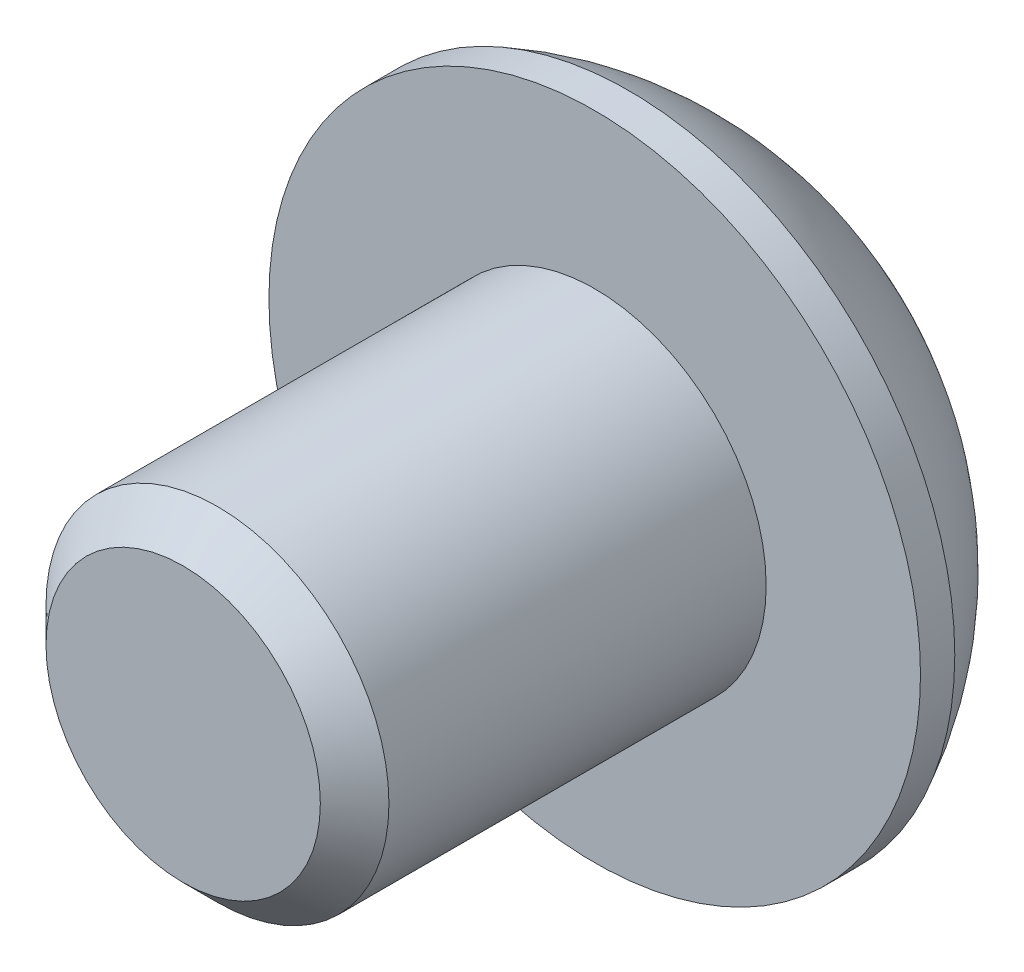
ISO-10303-21;
HEADER;
FILE_DESCRIPTION(('STEP AP214'),'2;1');
FILE_NAME('part.step','',(''),(''),'','','');
FILE_SCHEMA(('AUTOMOTIVE_DESIGN { 1 0 10303 214 1 1 1 1 }'));
ENDSEC;
DATA;
#1=APPLICATION_CONTEXT('core data for automotive mechanical design processes');
#2=APPLICATION_PROTOCOL_DEFINITION('international standard','automotive_design',2000,#1);
#3=PRODUCT_CONTEXT('',#1,'mechanical');
#4=PRODUCT('Part','Part','',(#3));
#5=PRODUCT_RELATED_PRODUCT_CATEGORY('part','',(#4));
#6=PRODUCT_DEFINITION_FORMATION('','',#4);
#7=PRODUCT_DEFINITION_CONTEXT('part definition',#1,'design');
#8=PRODUCT_DEFINITION('design','',#6,#7);
#9=PRODUCT_DEFINITION_SHAPE('','',#8);
#10=(LENGTH_UNIT() NAMED_UNIT(*) SI_UNIT(.MILLI.,.METRE.));
#11=(NAMED_UNIT(*) PLANE_ANGLE_UNIT() SI_UNIT($,.RADIAN.));
#12=(NAMED_UNIT(*) SI_UNIT($,.STERADIAN.) SOLID_ANGLE_UNIT());
#13=UNCERTAINTY_MEASURE_WITH_UNIT(LENGTH_MEASURE(1.E-05),#10,'distance_accuracy_value','');
#14=(GEOMETRIC_REPRESENTATION_CONTEXT(3) GLOBAL_UNCERTAINTY_ASSIGNED_CONTEXT((#13)) GLOBAL_UNIT_ASSIGNED_CONTEXT((#10,
#11,#12)) REPRESENTATION_CONTEXT('',''));
#15=CARTESIAN_POINT('',(0.,0.,0.));
#16=DIRECTION('',(0.,0.,1.));
#17=DIRECTION('',(1.,0.,0.));
#18=AXIS2_PLACEMENT_3D('',#15,#16,#17);
#19=CARTESIAN_POINT('',(0.,0.,-1.21));
#20=DIRECTION('',(0.,0.,1.));
#21=DIRECTION('',(1.,0.,0.));
#22=AXIS2_PLACEMENT_3D('',#19,#20,#21);
#23=PLANE('',#22);
#24=DIRECTION('',(0.,1.,0.));
#25=VECTOR('',#24,1.);
#26=CARTESIAN_POINT('',(-1.5,-0.866025403784438,-1.21));
#27=LINE('',#26,#25);
#28=CARTESIAN_POINT('',(-1.5,-0.866025403784439,-1.21));
#29=VERTEX_POINT('',#28);
#30=CARTESIAN_POINT('',(-1.5,0.866025403784439,-1.21));
#31=VERTEX_POINT('',#30);
#32=EDGE_CURVE('E127',#29,#31,#27,.T.);
#33=ORIENTED_EDGE('',*,*,#32,.T.);
#34=DIRECTION('',(-0.866025403784439,-0.5,0.));
#35=VECTOR('',#34,1.);
#36=CARTESIAN_POINT('',(-1.5,0.866025403784439,-1.21));
#37=LINE('',#36,#35);
#38=CARTESIAN_POINT('',(0.,1.73205080756888,-1.21));
#39=VERTEX_POINT('',#38);
#40=EDGE_CURVE('E132',#31,#39,#37,.F.);
#41=ORIENTED_EDGE('',*,*,#40,.T.);
#42=DIRECTION('',(-0.866025403784439,0.5,0.));
#43=VECTOR('',#42,1.);
#44=CARTESIAN_POINT('',(0.,1.73205080756888,-1.21));
#45=LINE('',#44,#43);
#46=CARTESIAN_POINT('',(1.5,0.866025403784439,-1.21));
#47=VERTEX_POINT('',#46);
#48=EDGE_CURVE('E86',#39,#47,#45,.F.);
#49=ORIENTED_EDGE('',*,*,#48,.T.);
#50=DIRECTION('',(0.,1.,0.));
#51=VECTOR('',#50,1.);
#52=CARTESIAN_POINT('',(1.5,0.866025403784438,-1.21));
#53=LINE('',#52,#51);
#54=CARTESIAN_POINT('',(1.5,-0.866025403784438,-1.21));
#55=VERTEX_POINT('',#54);
#56=EDGE_CURVE('E68',#47,#55,#53,.F.);
#57=ORIENTED_EDGE('',*,*,#56,.T.);
#58=DIRECTION('',(0.866025403784439,0.499999999999999,0.));
#59=VECTOR('',#58,1.);
#60=CARTESIAN_POINT('',(1.5,-0.866025403784438,-1.21));
#61=LINE('',#60,#59);
#62=CARTESIAN_POINT('',(0.,-1.73205080756888,-1.21));
#63=VERTEX_POINT('',#62);
#64=EDGE_CURVE('E74',#55,#63,#61,.F.);
#65=ORIENTED_EDGE('',*,*,#64,.T.);
#66=DIRECTION('',(0.866025403784438,-0.5,0.));
#67=VECTOR('',#66,1.);
#68=CARTESIAN_POINT('',(0.,-1.73205080756888,-1.21));
#69=LINE('',#68,#67);
#70=EDGE_CURVE('E121',#63,#29,#69,.F.);
#71=ORIENTED_EDGE('',*,*,#70,.T.);
#72=EDGE_LOOP('',(#33,#41,#49,#57,#65,#71));
#73=FACE_BOUND('',#72,.T.);
#74=ADVANCED_FACE('F17',(#73),#23,.F.);
#75=CARTESIAN_POINT('',(1.5,-0.866025403784438,-2.75));
#76=DIRECTION('',(0.499999999999999,-0.866025403784439,0.));
#77=DIRECTION('',(0.866025403784439,0.499999999999999,0.));
#78=AXIS2_PLACEMENT_3D('',#75,#76,#77);
#79=PLANE('',#78);
#80=ORIENTED_EDGE('',*,*,#64,.F.);
#81=DIRECTION('',(0.,0.,-1.));
#82=VECTOR('',#81,1.);
#83=CARTESIAN_POINT('',(1.5,-0.866025403784438,-2.75));
#84=LINE('',#83,#82);
#85=CARTESIAN_POINT('',(1.5,-0.866025403784438,-2.75));
#86=VERTEX_POINT('',#85);
#87=EDGE_CURVE('E77',#55,#86,#84,.T.);
#88=ORIENTED_EDGE('',*,*,#87,.T.);
#89=DIRECTION('',(0.866025403784438,0.500000000000001,0.));
#90=VECTOR('',#89,1.);
#91=CARTESIAN_POINT('',(0.,-1.73205080756888,-2.75));
#92=LINE('',#91,#90);
#93=CARTESIAN_POINT('',(0.,-1.73205080756888,-2.75));
#94=VERTEX_POINT('',#93);
#95=EDGE_CURVE('E117',#94,#86,#92,.T.);
#96=ORIENTED_EDGE('',*,*,#95,.F.);
#97=DIRECTION('',(0.,0.,1.));
#98=VECTOR('',#97,1.);
#99=CARTESIAN_POINT('',(0.,-1.73205080756888,-2.75));
#100=LINE('',#99,#98);
#101=EDGE_CURVE('E79',#94,#63,#100,.T.);
#102=ORIENTED_EDGE('',*,*,#101,.T.);
#103=EDGE_LOOP('',(#80,#88,#96,#102));
#104=FACE_BOUND('',#103,.T.);
#105=ADVANCED_FACE('F75',(#104),#79,.F.);
#106=CARTESIAN_POINT('',(1.5,0.866025403784438,-2.75));
#107=DIRECTION('',(1.,0.,0.));
#108=DIRECTION('',(0.,0.,-1.));
#109=AXIS2_PLACEMENT_3D('',#106,#107,#108);
#110=PLANE('',#109);
#111=ORIENTED_EDGE('',*,*,#56,.F.);
#112=DIRECTION('',(0.,0.,1.));
#113=VECTOR('',#112,1.);
#114=CARTESIAN_POINT('',(1.5,0.866025403784441,-2.75));
#115=LINE('',#114,#113);
#116=CARTESIAN_POINT('',(1.5,0.866025403784439,-2.75));
#117=VERTEX_POINT('',#116);
#118=EDGE_CURVE('E134',#47,#117,#115,.F.);
#119=ORIENTED_EDGE('',*,*,#118,.T.);
#120=DIRECTION('',(0.,1.,0.));
#121=VECTOR('',#120,1.);
#122=CARTESIAN_POINT('',(1.5,-1.1875,-2.75));
#123=LINE('',#122,#121);
#124=EDGE_CURVE('E85',#86,#117,#123,.T.);
#125=ORIENTED_EDGE('',*,*,#124,.F.);
#126=ORIENTED_EDGE('',*,*,#87,.F.);
#127=EDGE_LOOP('',(#111,#119,#125,#126));
#128=FACE_BOUND('',#127,.T.);
#129=ADVANCED_FACE('F84',(#128),#110,.F.);
#130=CARTESIAN_POINT('',(0.,1.73205080756888,-2.75));
#131=DIRECTION('',(0.5,0.866025403784439,0.));
#132=DIRECTION('',(-0.866025403784439,0.5,0.));
#133=AXIS2_PLACEMENT_3D('',#130,#131,#132);
#134=PLANE('',#133);
#135=ORIENTED_EDGE('',*,*,#48,.F.);
#136=DIRECTION('',(0.,0.,1.));
#137=VECTOR('',#136,1.);
#138=CARTESIAN_POINT('',(0.,1.73205080756888,-2.75));
#139=LINE('',#138,#137);
#140=CARTESIAN_POINT('',(0.,1.73205080756888,-2.75));
#141=VERTEX_POINT('',#140);
#142=EDGE_CURVE('E129',#39,#141,#139,.F.);
#143=ORIENTED_EDGE('',*,*,#142,.T.);
#144=DIRECTION('',(-0.866025403784438,0.500000000000002,0.));
#145=VECTOR('',#144,1.);
#146=CARTESIAN_POINT('',(1.5,0.866025403784438,-2.75));
#147=LINE('',#146,#145);
#148=EDGE_CURVE('E114',#117,#141,#147,.T.);
#149=ORIENTED_EDGE('',*,*,#148,.F.);
#150=ORIENTED_EDGE('',*,*,#118,.F.);
#151=EDGE_LOOP('',(#135,#143,#149,#150));
#152=FACE_BOUND('',#151,.T.);
#153=ADVANCED_FACE('F137',(#152),#134,.F.);
#154=CARTESIAN_POINT('',(-1.5,0.866025403784439,-2.75));
#155=DIRECTION('',(-0.5,0.866025403784439,0.));
#156=DIRECTION('',(-0.866025403784439,-0.5,0.));
#157=AXIS2_PLACEMENT_3D('',#154,#155,#156);
#158=PLANE('',#157);
#159=ORIENTED_EDGE('',*,*,#40,.F.);
#160=DIRECTION('',(0.,0.,1.));
#161=VECTOR('',#160,1.);
#162=CARTESIAN_POINT('',(-1.5,0.866025403784439,-2.75));
#163=LINE('',#162,#161);
#164=CARTESIAN_POINT('',(-1.5,0.866025403784439,-2.75));
#165=VERTEX_POINT('',#164);
#166=EDGE_CURVE('E124',#31,#165,#163,.F.);
#167=ORIENTED_EDGE('',*,*,#166,.T.);
#168=DIRECTION('',(-0.866025403784438,-0.500000000000001,0.));
#169=VECTOR('',#168,1.);
#170=CARTESIAN_POINT('',(0.,1.73205080756888,-2.75));
#171=LINE('',#170,#169);
#172=EDGE_CURVE('E109',#141,#165,#171,.T.);
#173=ORIENTED_EDGE('',*,*,#172,.F.);
#174=ORIENTED_EDGE('',*,*,#142,.F.);
#175=EDGE_LOOP('',(#159,#167,#173,#174));
#176=FACE_BOUND('',#175,.T.);
#177=ADVANCED_FACE('F144',(#176),#158,.F.);
#178=CARTESIAN_POINT('',(-1.5,-0.866025403784438,-2.75));
#179=DIRECTION('',(-1.,0.,0.));
#180=DIRECTION('',(0.,0.,1.));
#181=AXIS2_PLACEMENT_3D('',#178,#179,#180);
#182=PLANE('',#181);
#183=ORIENTED_EDGE('',*,*,#32,.F.);
#184=DIRECTION('',(0.,0.,1.));
#185=VECTOR('',#184,1.);
#186=CARTESIAN_POINT('',(-1.5,-0.866025403784441,-2.75));
#187=LINE('',#186,#185);
#188=CARTESIAN_POINT('',(-1.5,-0.866025403784439,-2.75));
#189=VERTEX_POINT('',#188);
#190=EDGE_CURVE('E119',#29,#189,#187,.F.);
#191=ORIENTED_EDGE('',*,*,#190,.T.);
#192=DIRECTION('',(0.,1.,0.));
#193=VECTOR('',#192,1.);
#194=CARTESIAN_POINT('',(-1.5,-1.1875,-2.75));
#195=LINE('',#194,#193);
#196=EDGE_CURVE('E35',#165,#189,#195,.F.);
#197=ORIENTED_EDGE('',*,*,#196,.F.);
#198=ORIENTED_EDGE('',*,*,#166,.F.);
#199=EDGE_LOOP('',(#183,#191,#197,#198));
#200=FACE_BOUND('',#199,.T.);
#201=ADVANCED_FACE('F146',(#200),#182,.F.);
#202=CARTESIAN_POINT('',(0.,-1.73205080756888,-2.75));
#203=DIRECTION('',(-0.5,-0.866025403784438,0.));
#204=DIRECTION('',(0.866025403784438,-0.5,0.));
#205=AXIS2_PLACEMENT_3D('',#202,#203,#204);
#206=PLANE('',#205);
#207=ORIENTED_EDGE('',*,*,#70,.F.);
#208=ORIENTED_EDGE('',*,*,#101,.F.);
#209=DIRECTION('',(0.866025403784438,-0.500000000000002,0.));
#210=VECTOR('',#209,1.);
#211=CARTESIAN_POINT('',(-1.5,-0.866025403784438,-2.75));
#212=LINE('',#211,#210);
#213=EDGE_CURVE('E104',#189,#94,#212,.T.);
#214=ORIENTED_EDGE('',*,*,#213,.F.);
#215=ORIENTED_EDGE('',*,*,#190,.F.);
#216=EDGE_LOOP('',(#207,#208,#214,#215));
#217=FACE_BOUND('',#216,.T.);
#218=ADVANCED_FACE('F149',(#217),#206,.F.);
#219=CARTESIAN_POINT('',(0.,-1.1875,-2.75));
#220=DIRECTION('',(0.,0.,-1.));
#221=DIRECTION('',(-1.,0.,0.));
#222=AXIS2_PLACEMENT_3D('',#219,#220,#221);
#223=PLANE('',#222);
#224=ORIENTED_EDGE('',*,*,#196,.T.);
#225=ORIENTED_EDGE('',*,*,#213,.T.);
#226=ORIENTED_EDGE('',*,*,#95,.T.);
#227=ORIENTED_EDGE('',*,*,#124,.T.);
#228=ORIENTED_EDGE('',*,*,#148,.T.);
#229=ORIENTED_EDGE('',*,*,#172,.T.);
#230=EDGE_LOOP('',(#224,#225,#226,#227,#228,#229));
#231=FACE_BOUND('',#230,.T.);
#232=CARTESIAN_POINT('',(0.,0.,-2.75));
#233=DIRECTION('',(0.,0.,-1.));
#234=DIRECTION('',(-1.,0.,0.));
#235=AXIS2_PLACEMENT_3D('',#232,#233,#234);
#236=CIRCLE('',#235,2.375);
#237=CARTESIAN_POINT('',(-2.375,0.,-2.75));
#238=VERTEX_POINT('',#237);
#239=EDGE_CURVE('E20',#238,#238,#236,.F.);
#240=ORIENTED_EDGE('',*,*,#239,.F.);
#241=EDGE_LOOP('',(#240));
#242=FACE_BOUND('',#241,.T.);
#243=ADVANCED_FACE('F140',(#231,#242),#223,.T.);
#244=CARTESIAN_POINT('',(0.,0.,6.));
#245=DIRECTION('',(0.,0.,1.));
#246=DIRECTION('',(1.,0.,0.));
#247=AXIS2_PLACEMENT_3D('',#244,#245,#246);
#248=PLANE('',#247);
#249=CARTESIAN_POINT('',(0.,0.,5.99999999997181));
#250=DIRECTION('',(0.,0.,-1.));
#251=DIRECTION('',(-1.,0.,0.));
#252=AXIS2_PLACEMENT_3D('',#249,#250,#251);
#253=CIRCLE('',#252,1.99999999995271);
#254=CARTESIAN_POINT('',(-1.99999999995271,0.,5.99999999997181));
#255=VERTEX_POINT('',#254);
#256=EDGE_CURVE('E96',#255,#255,#253,.T.);
#257=ORIENTED_EDGE('',*,*,#256,.F.);
#258=EDGE_LOOP('',(#257));
#259=FACE_BOUND('',#258,.T.);
#260=ADVANCED_FACE('F157',(#259),#248,.T.);
#261=CARTESIAN_POINT('',(0.,0.,1.7));
#262=DIRECTION('',(0.,0.,-1.));
#263=DIRECTION('',(0.,-1.,0.));
#264=AXIS2_PLACEMENT_3D('',#261,#262,#263);
#265=DEGENERATE_TOROIDAL_SURFACE('',#264,0.412500000000001,4.86352816893251,.T.);
#266=CARTESIAN_POINT('',(0.,0.,-0.499999999999999));
#267=DIRECTION('',(0.,0.,-1.));
#268=DIRECTION('',(-1.,0.,0.));
#269=AXIS2_PLACEMENT_3D('',#266,#267,#268);
#270=CIRCLE('',#269,4.75);
#271=CARTESIAN_POINT('',(-4.75,0.,-0.499999999999999));
#272=VERTEX_POINT('',#271);
#273=EDGE_CURVE('E98',#272,#272,#270,.F.);
#274=ORIENTED_EDGE('',*,*,#273,.F.);
#275=EDGE_LOOP('',(#274));
#276=FACE_BOUND('',#275,.T.);
#277=ORIENTED_EDGE('',*,*,#239,.T.);
#278=EDGE_LOOP('',(#277));
#279=FACE_BOUND('',#278,.T.);
#280=ADVANCED_FACE('F180',(#276,#279),#265,.T.);
#281=CARTESIAN_POINT('',(0.,0.,5.49999999986994));
#282=DIRECTION('',(0.,0.,-1.));
#283=DIRECTION('',(-1.,0.,0.));
#284=AXIS2_PLACEMENT_3D('',#281,#282,#283);
#285=CONICAL_SURFACE('',#284,2.50000000005457,0.785398163397448);
#286=CARTESIAN_POINT('',(0.,0.,5.5));
#287=DIRECTION('',(0.,0.,1.));
#288=DIRECTION('',(1.,0.,0.));
#289=AXIS2_PLACEMENT_3D('',#286,#287,#288);
#290=CIRCLE('',#289,2.5);
#291=CARTESIAN_POINT('',(2.5,0.,5.5));
#292=VERTEX_POINT('',#291);
#293=EDGE_CURVE('E95',#292,#292,#290,.F.);
#294=ORIENTED_EDGE('',*,*,#293,.F.);
#295=EDGE_LOOP('',(#294));
#296=FACE_BOUND('',#295,.T.);
#297=ORIENTED_EDGE('',*,*,#256,.T.);
#298=EDGE_LOOP('',(#297));
#299=FACE_BOUND('',#298,.T.);
#300=ADVANCED_FACE('F176',(#296,#299),#285,.T.);
#301=CARTESIAN_POINT('',(0.,0.,-0.25));
#302=DIRECTION('',(0.,0.,-1.));
#303=DIRECTION('',(-1.,0.,0.));
#304=AXIS2_PLACEMENT_3D('',#301,#302,#303);
#305=CYLINDRICAL_SURFACE('',#304,4.75);
#306=CARTESIAN_POINT('',(0.,0.,0.));
#307=DIRECTION('',(0.,0.,-1.));
#308=DIRECTION('',(-1.,0.,0.));
#309=AXIS2_PLACEMENT_3D('',#306,#307,#308);
#310=CIRCLE('',#309,4.75);
#311=CARTESIAN_POINT('',(-4.75,0.,0.));
#312=VERTEX_POINT('',#311);
#313=EDGE_CURVE('E26',#312,#312,#310,.T.);
#314=ORIENTED_EDGE('',*,*,#313,.T.);
#315=EDGE_LOOP('',(#314));
#316=FACE_BOUND('',#315,.T.);
#317=ORIENTED_EDGE('',*,*,#273,.T.);
#318=EDGE_LOOP('',(#317));
#319=FACE_BOUND('',#318,.T.);
#320=ADVANCED_FACE('F168',(#316,#319),#305,.T.);
#321=CARTESIAN_POINT('',(0.,0.,0.));
#322=DIRECTION('',(0.,0.,1.));
#323=DIRECTION('',(1.,0.,0.));
#324=AXIS2_PLACEMENT_3D('',#321,#322,#323);
#325=CYLINDRICAL_SURFACE('',#324,2.5);
#326=CARTESIAN_POINT('',(0.,0.,0.));
#327=DIRECTION('',(0.,0.,1.));
#328=DIRECTION('',(1.,0.,0.));
#329=AXIS2_PLACEMENT_3D('',#326,#327,#328);
#330=CIRCLE('',#329,2.5);
#331=CARTESIAN_POINT('',(2.5,0.,0.));
#332=VERTEX_POINT('',#331);
#333=EDGE_CURVE('E11',#332,#332,#330,.T.);
#334=ORIENTED_EDGE('',*,*,#333,.T.);
#335=EDGE_LOOP('',(#334));
#336=FACE_BOUND('',#335,.T.);
#337=ORIENTED_EDGE('',*,*,#293,.T.);
#338=EDGE_LOOP('',(#337));
#339=FACE_BOUND('',#338,.T.);
#340=ADVANCED_FACE('F162',(#336,#339),#325,.T.);
#341=CARTESIAN_POINT('',(0.,-2.375,0.));
#342=DIRECTION('',(0.,0.,-1.));
#343=DIRECTION('',(-1.,0.,0.));
#344=AXIS2_PLACEMENT_3D('',#341,#342,#343);
#345=PLANE('',#344);
#346=ORIENTED_EDGE('',*,*,#333,.F.);
#347=EDGE_LOOP('',(#346));
#348=FACE_BOUND('',#347,.T.);
#349=ORIENTED_EDGE('',*,*,#313,.F.);
#350=EDGE_LOOP('',(#349));
#351=FACE_BOUND('',#350,.T.);
#352=ADVANCED_FACE('F160',(#348,#351),#345,.F.);
#353=CLOSED_SHELL('',(#74,#105,#129,#153,#177,#201,#218,#243,#260,#280,#300,#320,#340,#352));
#354=MANIFOLD_SOLID_BREP('B1',#353);
#355=ADVANCED_BREP_SHAPE_REPRESENTATION('',(#18,#354),#14);
#356=SHAPE_DEFINITION_REPRESENTATION(#9,#355);
ENDSEC;
END-ISO-10303-21;
